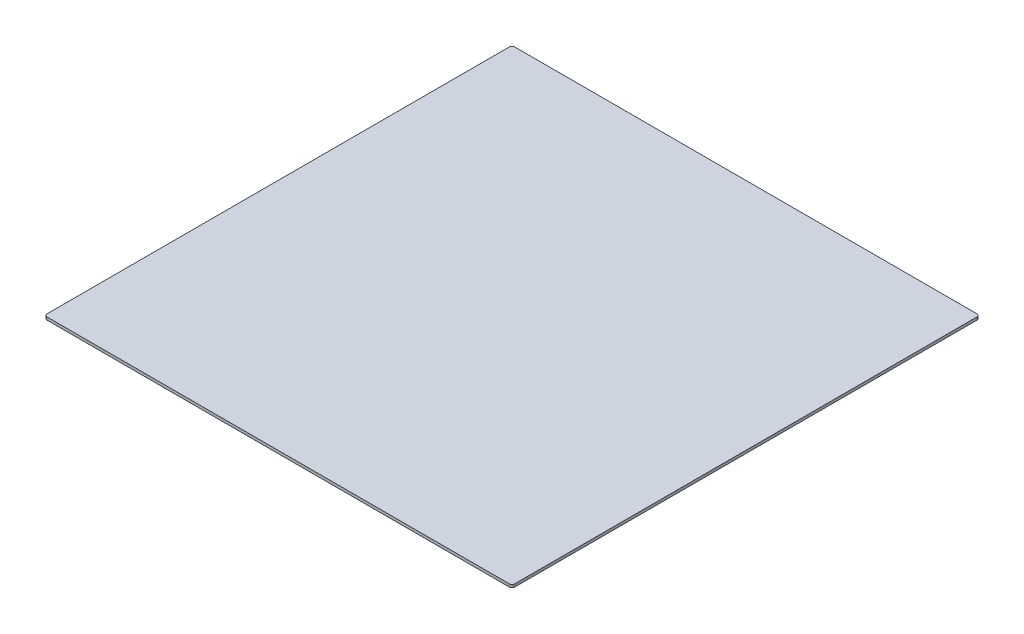
ISO-10303-21;
HEADER;
FILE_DESCRIPTION(('STEP AP214'),'2;1');
FILE_NAME('part.step','',(''),(''),'','','');
FILE_SCHEMA(('AUTOMOTIVE_DESIGN { 1 0 10303 214 1 1 1 1 }'));
ENDSEC;
DATA;
#1=APPLICATION_CONTEXT('core data for automotive mechanical design processes');
#2=APPLICATION_PROTOCOL_DEFINITION('international standard','automotive_design',2000,#1);
#3=PRODUCT_CONTEXT('',#1,'mechanical');
#4=PRODUCT('Part','Part','',(#3));
#5=PRODUCT_RELATED_PRODUCT_CATEGORY('part','',(#4));
#6=PRODUCT_DEFINITION_FORMATION('','',#4);
#7=PRODUCT_DEFINITION_CONTEXT('part definition',#1,'design');
#8=PRODUCT_DEFINITION('design','',#6,#7);
#9=PRODUCT_DEFINITION_SHAPE('','',#8);
#10=(LENGTH_UNIT() NAMED_UNIT(*) SI_UNIT(.MILLI.,.METRE.));
#11=(NAMED_UNIT(*) PLANE_ANGLE_UNIT() SI_UNIT($,.RADIAN.));
#12=(NAMED_UNIT(*) SI_UNIT($,.STERADIAN.) SOLID_ANGLE_UNIT());
#13=UNCERTAINTY_MEASURE_WITH_UNIT(LENGTH_MEASURE(1.E-05),#10,'distance_accuracy_value','');
#14=(GEOMETRIC_REPRESENTATION_CONTEXT(3) GLOBAL_UNCERTAINTY_ASSIGNED_CONTEXT((#13)) GLOBAL_UNIT_ASSIGNED_CONTEXT((#10,
#11,#12)) REPRESENTATION_CONTEXT('',''));
#15=CARTESIAN_POINT('',(0.,0.,0.));
#16=DIRECTION('',(0.,0.,1.));
#17=DIRECTION('',(1.,0.,0.));
#18=AXIS2_PLACEMENT_3D('',#15,#16,#17);
#19=CARTESIAN_POINT('',(250.,3.,-250.));
#20=DIRECTION('',(-1.,0.,0.));
#21=DIRECTION('',(0.,0.,1.));
#22=AXIS2_PLACEMENT_3D('',#19,#20,#21);
#23=PLANE('',#22);
#24=DIRECTION('',(0.,0.,-1.));
#25=VECTOR('',#24,1.);
#26=CARTESIAN_POINT('',(250.,0.,-250.));
#27=LINE('',#26,#25);
#28=CARTESIAN_POINT('',(250.,0.,247.));
#29=VERTEX_POINT('',#28);
#30=CARTESIAN_POINT('',(250.,0.,-247.));
#31=VERTEX_POINT('',#30);
#32=EDGE_CURVE('E193',#29,#31,#27,.T.);
#33=ORIENTED_EDGE('',*,*,#32,.T.);
#34=DIRECTION('',(0.,-1.,0.));
#35=VECTOR('',#34,1.);
#36=CARTESIAN_POINT('',(250.,3.,-247.));
#37=LINE('',#36,#35);
#38=CARTESIAN_POINT('',(250.,3.,-247.));
#39=VERTEX_POINT('',#38);
#40=EDGE_CURVE('E13',#31,#39,#37,.F.);
#41=ORIENTED_EDGE('',*,*,#40,.T.);
#42=DIRECTION('',(0.,0.,-1.));
#43=VECTOR('',#42,1.);
#44=CARTESIAN_POINT('',(250.,3.,-250.));
#45=LINE('',#44,#43);
#46=CARTESIAN_POINT('',(250.,3.,247.));
#47=VERTEX_POINT('',#46);
#48=EDGE_CURVE('E144',#47,#39,#45,.T.);
#49=ORIENTED_EDGE('',*,*,#48,.F.);
#50=DIRECTION('',(0.,-1.,0.));
#51=VECTOR('',#50,1.);
#52=CARTESIAN_POINT('',(250.,3.,247.));
#53=LINE('',#52,#51);
#54=EDGE_CURVE('E57',#47,#29,#53,.T.);
#55=ORIENTED_EDGE('',*,*,#54,.T.);
#56=EDGE_LOOP('',(#33,#41,#49,#55));
#57=FACE_BOUND('',#56,.T.);
#58=ADVANCED_FACE('F48',(#57),#23,.F.);
#59=CARTESIAN_POINT('',(-250.,3.,-250.));
#60=DIRECTION('',(0.,0.,1.));
#61=DIRECTION('',(1.,0.,0.));
#62=AXIS2_PLACEMENT_3D('',#59,#60,#61);
#63=PLANE('',#62);
#64=DIRECTION('',(-1.,0.,0.));
#65=VECTOR('',#64,1.);
#66=CARTESIAN_POINT('',(-250.,0.,-250.));
#67=LINE('',#66,#65);
#68=CARTESIAN_POINT('',(247.,0.,-250.));
#69=VERTEX_POINT('',#68);
#70=CARTESIAN_POINT('',(-247.,0.,-250.));
#71=VERTEX_POINT('',#70);
#72=EDGE_CURVE('E152',#69,#71,#67,.T.);
#73=ORIENTED_EDGE('',*,*,#72,.T.);
#74=DIRECTION('',(0.,-1.,0.));
#75=VECTOR('',#74,1.);
#76=CARTESIAN_POINT('',(-247.,3.,-250.));
#77=LINE('',#76,#75);
#78=CARTESIAN_POINT('',(-247.,3.,-250.));
#79=VERTEX_POINT('',#78);
#80=EDGE_CURVE('E64',#71,#79,#77,.F.);
#81=ORIENTED_EDGE('',*,*,#80,.T.);
#82=DIRECTION('',(-1.,0.,0.));
#83=VECTOR('',#82,1.);
#84=CARTESIAN_POINT('',(-250.,3.,-250.));
#85=LINE('',#84,#83);
#86=CARTESIAN_POINT('',(247.,3.,-250.));
#87=VERTEX_POINT('',#86);
#88=EDGE_CURVE('E150',#87,#79,#85,.T.);
#89=ORIENTED_EDGE('',*,*,#88,.F.);
#90=DIRECTION('',(0.,-1.,0.));
#91=VECTOR('',#90,1.);
#92=CARTESIAN_POINT('',(247.,3.,-250.));
#93=LINE('',#92,#91);
#94=EDGE_CURVE('E181',#87,#69,#93,.T.);
#95=ORIENTED_EDGE('',*,*,#94,.T.);
#96=EDGE_LOOP('',(#73,#81,#89,#95));
#97=FACE_BOUND('',#96,.T.);
#98=ADVANCED_FACE('F220',(#97),#63,.F.);
#99=CARTESIAN_POINT('',(-250.,3.,-250.));
#100=DIRECTION('',(1.,0.,0.));
#101=DIRECTION('',(0.,0.,-1.));
#102=AXIS2_PLACEMENT_3D('',#99,#100,#101);
#103=PLANE('',#102);
#104=DIRECTION('',(0.,0.,1.));
#105=VECTOR('',#104,1.);
#106=CARTESIAN_POINT('',(-250.,0.,-250.));
#107=LINE('',#106,#105);
#108=CARTESIAN_POINT('',(-250.,0.,-247.));
#109=VERTEX_POINT('',#108);
#110=CARTESIAN_POINT('',(-250.,0.,247.));
#111=VERTEX_POINT('',#110);
#112=EDGE_CURVE('E145',#109,#111,#107,.T.);
#113=ORIENTED_EDGE('',*,*,#112,.T.);
#114=DIRECTION('',(0.,-1.,0.));
#115=VECTOR('',#114,1.);
#116=CARTESIAN_POINT('',(-250.,3.,247.));
#117=LINE('',#116,#115);
#118=CARTESIAN_POINT('',(-250.,3.,247.));
#119=VERTEX_POINT('',#118);
#120=EDGE_CURVE('E120',#111,#119,#117,.F.);
#121=ORIENTED_EDGE('',*,*,#120,.T.);
#122=DIRECTION('',(0.,0.,1.));
#123=VECTOR('',#122,1.);
#124=CARTESIAN_POINT('',(-250.,3.,-250.));
#125=LINE('',#124,#123);
#126=CARTESIAN_POINT('',(-250.,3.,-247.));
#127=VERTEX_POINT('',#126);
#128=EDGE_CURVE('E205',#127,#119,#125,.T.);
#129=ORIENTED_EDGE('',*,*,#128,.F.);
#130=DIRECTION('',(0.,-1.,0.));
#131=VECTOR('',#130,1.);
#132=CARTESIAN_POINT('',(-250.,3.,-247.));
#133=LINE('',#132,#131);
#134=EDGE_CURVE('E126',#127,#109,#133,.T.);
#135=ORIENTED_EDGE('',*,*,#134,.T.);
#136=EDGE_LOOP('',(#113,#121,#129,#135));
#137=FACE_BOUND('',#136,.T.);
#138=ADVANCED_FACE('F219',(#137),#103,.F.);
#139=CARTESIAN_POINT('',(-250.,3.,250.));
#140=DIRECTION('',(0.,0.,-1.));
#141=DIRECTION('',(-1.,0.,0.));
#142=AXIS2_PLACEMENT_3D('',#139,#140,#141);
#143=PLANE('',#142);
#144=DIRECTION('',(1.,0.,0.));
#145=VECTOR('',#144,1.);
#146=CARTESIAN_POINT('',(-250.,3.,250.));
#147=LINE('',#146,#145);
#148=CARTESIAN_POINT('',(-247.,3.,250.));
#149=VERTEX_POINT('',#148);
#150=CARTESIAN_POINT('',(247.,3.,250.));
#151=VERTEX_POINT('',#150);
#152=EDGE_CURVE('E136',#149,#151,#147,.T.);
#153=ORIENTED_EDGE('',*,*,#152,.F.);
#154=DIRECTION('',(0.,-1.,0.));
#155=VECTOR('',#154,1.);
#156=CARTESIAN_POINT('',(-247.,3.,250.));
#157=LINE('',#156,#155);
#158=CARTESIAN_POINT('',(-247.,0.,250.));
#159=VERTEX_POINT('',#158);
#160=EDGE_CURVE('E119',#149,#159,#157,.T.);
#161=ORIENTED_EDGE('',*,*,#160,.T.);
#162=DIRECTION('',(1.,0.,0.));
#163=VECTOR('',#162,1.);
#164=CARTESIAN_POINT('',(-250.,0.,250.));
#165=LINE('',#164,#163);
#166=CARTESIAN_POINT('',(247.,0.,250.));
#167=VERTEX_POINT('',#166);
#168=EDGE_CURVE('E133',#159,#167,#165,.T.);
#169=ORIENTED_EDGE('',*,*,#168,.T.);
#170=DIRECTION('',(0.,-1.,0.));
#171=VECTOR('',#170,1.);
#172=CARTESIAN_POINT('',(247.,3.,250.));
#173=LINE('',#172,#171);
#174=EDGE_CURVE('E139',#167,#151,#173,.F.);
#175=ORIENTED_EDGE('',*,*,#174,.T.);
#176=EDGE_LOOP('',(#153,#161,#169,#175));
#177=FACE_BOUND('',#176,.T.);
#178=ADVANCED_FACE('F132',(#177),#143,.F.);
#179=CARTESIAN_POINT('',(0.,3.,0.));
#180=DIRECTION('',(0.,1.,0.));
#181=DIRECTION('',(0.,0.,1.));
#182=AXIS2_PLACEMENT_3D('',#179,#180,#181);
#183=PLANE('',#182);
#184=ORIENTED_EDGE('',*,*,#128,.T.);
#185=CARTESIAN_POINT('',(-247.,3.,247.));
#186=DIRECTION('',(0.,1.,0.));
#187=DIRECTION('',(0.,0.,1.));
#188=AXIS2_PLACEMENT_3D('',#185,#186,#187);
#189=CIRCLE('',#188,3.);
#190=EDGE_CURVE('E178',#119,#149,#189,.T.);
#191=ORIENTED_EDGE('',*,*,#190,.T.);
#192=ORIENTED_EDGE('',*,*,#152,.T.);
#193=CARTESIAN_POINT('',(247.,3.,247.));
#194=DIRECTION('',(0.,1.,0.));
#195=DIRECTION('',(0.,0.,1.));
#196=AXIS2_PLACEMENT_3D('',#193,#194,#195);
#197=CIRCLE('',#196,3.);
#198=EDGE_CURVE('E170',#151,#47,#197,.T.);
#199=ORIENTED_EDGE('',*,*,#198,.T.);
#200=ORIENTED_EDGE('',*,*,#48,.T.);
#201=CARTESIAN_POINT('',(247.,3.,-247.));
#202=DIRECTION('',(0.,1.,0.));
#203=DIRECTION('',(0.,0.,1.));
#204=AXIS2_PLACEMENT_3D('',#201,#202,#203);
#205=CIRCLE('',#204,3.);
#206=EDGE_CURVE('E71',#39,#87,#205,.T.);
#207=ORIENTED_EDGE('',*,*,#206,.T.);
#208=ORIENTED_EDGE('',*,*,#88,.T.);
#209=CARTESIAN_POINT('',(-247.,3.,-247.));
#210=DIRECTION('',(0.,1.,0.));
#211=DIRECTION('',(0.,0.,1.));
#212=AXIS2_PLACEMENT_3D('',#209,#210,#211);
#213=CIRCLE('',#212,3.);
#214=EDGE_CURVE('E175',#79,#127,#213,.T.);
#215=ORIENTED_EDGE('',*,*,#214,.T.);
#216=EDGE_LOOP('',(#184,#191,#192,#199,#200,#207,#208,#215));
#217=FACE_BOUND('',#216,.T.);
#218=ADVANCED_FACE('F212',(#217),#183,.T.);
#219=CARTESIAN_POINT('',(0.,0.,0.));
#220=DIRECTION('',(0.,1.,0.));
#221=DIRECTION('',(0.,0.,1.));
#222=AXIS2_PLACEMENT_3D('',#219,#220,#221);
#223=PLANE('',#222);
#224=ORIENTED_EDGE('',*,*,#168,.F.);
#225=CARTESIAN_POINT('',(-247.,0.,247.));
#226=DIRECTION('',(0.,1.,0.));
#227=DIRECTION('',(0.,0.,1.));
#228=AXIS2_PLACEMENT_3D('',#225,#226,#227);
#229=CIRCLE('',#228,3.);
#230=EDGE_CURVE('E115',#159,#111,#229,.F.);
#231=ORIENTED_EDGE('',*,*,#230,.T.);
#232=ORIENTED_EDGE('',*,*,#112,.F.);
#233=CARTESIAN_POINT('',(-247.,0.,-247.));
#234=DIRECTION('',(0.,1.,0.));
#235=DIRECTION('',(0.,0.,1.));
#236=AXIS2_PLACEMENT_3D('',#233,#234,#235);
#237=CIRCLE('',#236,3.);
#238=EDGE_CURVE('E127',#109,#71,#237,.F.);
#239=ORIENTED_EDGE('',*,*,#238,.T.);
#240=ORIENTED_EDGE('',*,*,#72,.F.);
#241=CARTESIAN_POINT('',(247.,0.,-247.));
#242=DIRECTION('',(0.,1.,0.));
#243=DIRECTION('',(0.,0.,1.));
#244=AXIS2_PLACEMENT_3D('',#241,#242,#243);
#245=CIRCLE('',#244,3.);
#246=EDGE_CURVE('E160',#69,#31,#245,.F.);
#247=ORIENTED_EDGE('',*,*,#246,.T.);
#248=ORIENTED_EDGE('',*,*,#32,.F.);
#249=CARTESIAN_POINT('',(247.,0.,247.));
#250=DIRECTION('',(0.,1.,0.));
#251=DIRECTION('',(0.,0.,1.));
#252=AXIS2_PLACEMENT_3D('',#249,#250,#251);
#253=CIRCLE('',#252,3.);
#254=EDGE_CURVE('E138',#29,#167,#253,.F.);
#255=ORIENTED_EDGE('',*,*,#254,.T.);
#256=EDGE_LOOP('',(#224,#231,#232,#239,#240,#247,#248,#255));
#257=FACE_BOUND('',#256,.T.);
#258=ADVANCED_FACE('F141',(#257),#223,.F.);
#259=CARTESIAN_POINT('',(-247.,3.,247.));
#260=DIRECTION('',(0.,-1.,0.));
#261=DIRECTION('',(0.,0.,-1.));
#262=AXIS2_PLACEMENT_3D('',#259,#260,#261);
#263=CYLINDRICAL_SURFACE('',#262,3.);
#264=ORIENTED_EDGE('',*,*,#190,.F.);
#265=ORIENTED_EDGE('',*,*,#120,.F.);
#266=ORIENTED_EDGE('',*,*,#230,.F.);
#267=ORIENTED_EDGE('',*,*,#160,.F.);
#268=EDGE_LOOP('',(#264,#265,#266,#267));
#269=FACE_BOUND('',#268,.T.);
#270=ADVANCED_FACE('F118',(#269),#263,.T.);
#271=CARTESIAN_POINT('',(-247.,3.,-247.));
#272=DIRECTION('',(0.,-1.,0.));
#273=DIRECTION('',(0.,0.,-1.));
#274=AXIS2_PLACEMENT_3D('',#271,#272,#273);
#275=CYLINDRICAL_SURFACE('',#274,3.);
#276=ORIENTED_EDGE('',*,*,#214,.F.);
#277=ORIENTED_EDGE('',*,*,#80,.F.);
#278=ORIENTED_EDGE('',*,*,#238,.F.);
#279=ORIENTED_EDGE('',*,*,#134,.F.);
#280=EDGE_LOOP('',(#276,#277,#278,#279));
#281=FACE_BOUND('',#280,.T.);
#282=ADVANCED_FACE('F217',(#281),#275,.T.);
#283=CARTESIAN_POINT('',(247.,3.,-247.));
#284=DIRECTION('',(0.,-1.,0.));
#285=DIRECTION('',(0.,0.,-1.));
#286=AXIS2_PLACEMENT_3D('',#283,#284,#285);
#287=CYLINDRICAL_SURFACE('',#286,3.);
#288=ORIENTED_EDGE('',*,*,#206,.F.);
#289=ORIENTED_EDGE('',*,*,#40,.F.);
#290=ORIENTED_EDGE('',*,*,#246,.F.);
#291=ORIENTED_EDGE('',*,*,#94,.F.);
#292=EDGE_LOOP('',(#288,#289,#290,#291));
#293=FACE_BOUND('',#292,.T.);
#294=ADVANCED_FACE('F222',(#293),#287,.T.);
#295=CARTESIAN_POINT('',(247.,3.,247.));
#296=DIRECTION('',(0.,-1.,0.));
#297=DIRECTION('',(0.,0.,-1.));
#298=AXIS2_PLACEMENT_3D('',#295,#296,#297);
#299=CYLINDRICAL_SURFACE('',#298,3.);
#300=ORIENTED_EDGE('',*,*,#198,.F.);
#301=ORIENTED_EDGE('',*,*,#174,.F.);
#302=ORIENTED_EDGE('',*,*,#254,.F.);
#303=ORIENTED_EDGE('',*,*,#54,.F.);
#304=EDGE_LOOP('',(#300,#301,#302,#303));
#305=FACE_BOUND('',#304,.T.);
#306=ADVANCED_FACE('F50',(#305),#299,.T.);
#307=CLOSED_SHELL('',(#58,#98,#138,#178,#218,#258,#270,#282,#294,#306));
#308=MANIFOLD_SOLID_BREP('B2',#307);
#309=ADVANCED_BREP_SHAPE_REPRESENTATION('',(#18,#308),#14);
#310=SHAPE_DEFINITION_REPRESENTATION(#9,#309);
ENDSEC;
END-ISO-10303-21;
